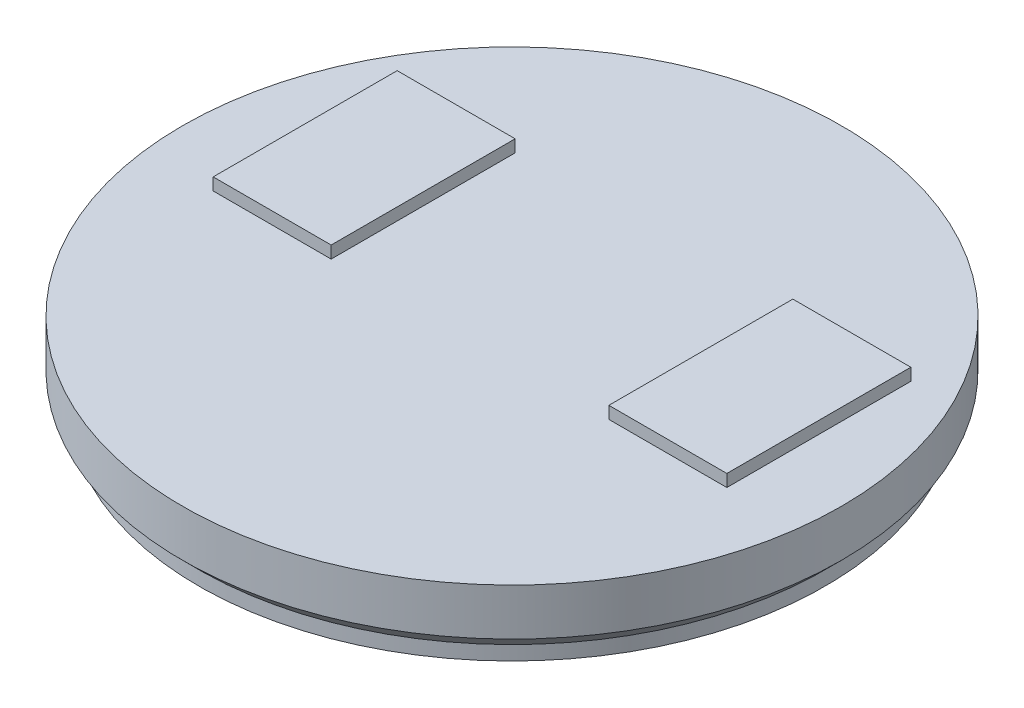
ISO-10303-21;
HEADER;
FILE_DESCRIPTION(('STEP AP214'),'2;1');
FILE_NAME('part.step','',(''),(''),'','','');
FILE_SCHEMA(('AUTOMOTIVE_DESIGN { 1 0 10303 214 1 1 1 1 }'));
ENDSEC;
DATA;
#1=APPLICATION_CONTEXT('core data for automotive mechanical design processes');
#2=APPLICATION_PROTOCOL_DEFINITION('international standard','automotive_design',2000,#1);
#3=PRODUCT_CONTEXT('',#1,'mechanical');
#4=PRODUCT('Part','Part','',(#3));
#5=PRODUCT_RELATED_PRODUCT_CATEGORY('part','',(#4));
#6=PRODUCT_DEFINITION_FORMATION('','',#4);
#7=PRODUCT_DEFINITION_CONTEXT('part definition',#1,'design');
#8=PRODUCT_DEFINITION('design','',#6,#7);
#9=PRODUCT_DEFINITION_SHAPE('','',#8);
#10=(LENGTH_UNIT() NAMED_UNIT(*) SI_UNIT(.MILLI.,.METRE.));
#11=(NAMED_UNIT(*) PLANE_ANGLE_UNIT() SI_UNIT($,.RADIAN.));
#12=(NAMED_UNIT(*) SI_UNIT($,.STERADIAN.) SOLID_ANGLE_UNIT());
#13=UNCERTAINTY_MEASURE_WITH_UNIT(LENGTH_MEASURE(1.E-05),#10,'distance_accuracy_value','');
#14=(GEOMETRIC_REPRESENTATION_CONTEXT(3) GLOBAL_UNCERTAINTY_ASSIGNED_CONTEXT((#13)) GLOBAL_UNIT_ASSIGNED_CONTEXT((#10,
#11,#12)) REPRESENTATION_CONTEXT('',''));
#15=CARTESIAN_POINT('',(0.,0.,0.));
#16=DIRECTION('',(0.,0.,1.));
#17=DIRECTION('',(1.,0.,0.));
#18=AXIS2_PLACEMENT_3D('',#15,#16,#17);
#19=CARTESIAN_POINT('',(0.,3.49999999999999,0.));
#20=DIRECTION('',(0.,1.,0.));
#21=DIRECTION('',(-1.,0.,0.));
#22=AXIS2_PLACEMENT_3D('',#19,#20,#21);
#23=CONICAL_SURFACE('',#22,77.,0.785398163397449);
#24=CARTESIAN_POINT('',(0.,3.49999999999999,0.));
#25=DIRECTION('',(0.,1.,0.));
#26=DIRECTION('',(-1.,0.,0.));
#27=AXIS2_PLACEMENT_3D('',#24,#25,#26);
#28=CIRCLE('',#27,77.);
#29=CARTESIAN_POINT('',(-77.,3.49999999999998,0.));
#30=VERTEX_POINT('',#29);
#31=EDGE_CURVE('E326',#30,#30,#28,.T.);
#32=ORIENTED_EDGE('',*,*,#31,.T.);
#33=EDGE_LOOP('',(#32));
#34=FACE_BOUND('',#33,.T.);
#35=CARTESIAN_POINT('',(0.,7.49999999999998,0.));
#36=DIRECTION('',(0.,1.,0.));
#37=DIRECTION('',(-1.,0.,0.));
#38=AXIS2_PLACEMENT_3D('',#35,#36,#37);
#39=CIRCLE('',#38,81.);
#40=CARTESIAN_POINT('',(-81.,7.49999999999997,0.));
#41=VERTEX_POINT('',#40);
#42=EDGE_CURVE('E48',#41,#41,#39,.T.);
#43=ORIENTED_EDGE('',*,*,#42,.F.);
#44=EDGE_LOOP('',(#43));
#45=FACE_BOUND('',#44,.T.);
#46=ADVANCED_FACE('F45',(#34,#45),#23,.T.);
#47=CARTESIAN_POINT('',(71.,12.,0.));
#48=DIRECTION('',(0.,1.,0.));
#49=DIRECTION('',(-1.,0.,0.));
#50=AXIS2_PLACEMENT_3D('',#47,#48,#49);
#51=PLANE('',#50);
#52=CARTESIAN_POINT('',(0.,12.,0.));
#53=DIRECTION('',(0.,-1.,0.));
#54=DIRECTION('',(1.,0.,0.));
#55=AXIS2_PLACEMENT_3D('',#52,#53,#54);
#56=CIRCLE('',#55,57.5);
#57=CARTESIAN_POINT('',(57.5,12.,0.));
#58=VERTEX_POINT('',#57);
#59=EDGE_CURVE('E251',#58,#58,#56,.T.);
#60=ORIENTED_EDGE('',*,*,#59,.F.);
#61=EDGE_LOOP('',(#60));
#62=FACE_BOUND('',#61,.T.);
#63=DIRECTION('',(0.,0.,1.));
#64=VECTOR('',#63,1.);
#65=CARTESIAN_POINT('',(60.875,12.,0.));
#66=LINE('',#65,#64);
#67=CARTESIAN_POINT('',(60.875,12.,-35.1461976369185));
#68=VERTEX_POINT('',#67);
#69=CARTESIAN_POINT('',(60.875,12.,35.1461976369185));
#70=VERTEX_POINT('',#69);
#71=EDGE_CURVE('E289',#68,#70,#66,.T.);
#72=ORIENTED_EDGE('',*,*,#71,.T.);
#73=DIRECTION('',(-0.866025403784439,0.,0.5));
#74=VECTOR('',#73,1.);
#75=CARTESIAN_POINT('',(30.4375,12.,52.7192964553777));
#76=LINE('',#75,#74);
#77=CARTESIAN_POINT('',(0.,12.,70.292395273837));
#78=VERTEX_POINT('',#77);
#79=EDGE_CURVE('E255',#70,#78,#76,.T.);
#80=ORIENTED_EDGE('',*,*,#79,.T.);
#81=DIRECTION('',(-0.866025403784439,0.,-0.5));
#82=VECTOR('',#81,1.);
#83=CARTESIAN_POINT('',(-30.4375,12.,52.7192964553777));
#84=LINE('',#83,#82);
#85=CARTESIAN_POINT('',(-60.875,12.,35.1461976369185));
#86=VERTEX_POINT('',#85);
#87=EDGE_CURVE('E261',#78,#86,#84,.T.);
#88=ORIENTED_EDGE('',*,*,#87,.T.);
#89=DIRECTION('',(0.,0.,-1.));
#90=VECTOR('',#89,1.);
#91=CARTESIAN_POINT('',(-60.875,12.,0.));
#92=LINE('',#91,#90);
#93=CARTESIAN_POINT('',(-60.875,12.,-35.1461976369185));
#94=VERTEX_POINT('',#93);
#95=EDGE_CURVE('E301',#86,#94,#92,.T.);
#96=ORIENTED_EDGE('',*,*,#95,.T.);
#97=DIRECTION('',(0.866025403784439,0.,-0.5));
#98=VECTOR('',#97,1.);
#99=CARTESIAN_POINT('',(-30.4375,12.,-52.7192964553777));
#100=LINE('',#99,#98);
#101=CARTESIAN_POINT('',(0.,12.,-70.2923952738369));
#102=VERTEX_POINT('',#101);
#103=EDGE_CURVE('E297',#94,#102,#100,.T.);
#104=ORIENTED_EDGE('',*,*,#103,.T.);
#105=DIRECTION('',(0.866025403784439,0.,0.5));
#106=VECTOR('',#105,1.);
#107=CARTESIAN_POINT('',(30.4375,12.,-52.7192964553777));
#108=LINE('',#107,#106);
#109=EDGE_CURVE('E293',#102,#68,#108,.T.);
#110=ORIENTED_EDGE('',*,*,#109,.T.);
#111=EDGE_LOOP('',(#72,#80,#88,#96,#104,#110));
#112=FACE_BOUND('',#111,.T.);
#113=ADVANCED_FACE('F373',(#62,#112),#51,.F.);
#114=CARTESIAN_POINT('',(30.4375,0.999999999999997,52.7192964553777));
#115=DIRECTION('',(-0.5,0.,-0.866025403784439));
#116=DIRECTION('',(-0.866025403784439,0.,0.5));
#117=AXIS2_PLACEMENT_3D('',#114,#115,#116);
#118=PLANE('',#117);
#119=ORIENTED_EDGE('',*,*,#79,.F.);
#120=DIRECTION('',(0.,1.,0.));
#121=VECTOR('',#120,1.);
#122=CARTESIAN_POINT('',(60.875,1.,35.1461976369185));
#123=LINE('',#122,#121);
#124=CARTESIAN_POINT('',(60.875,1.,35.1461976369185));
#125=VERTEX_POINT('',#124);
#126=EDGE_CURVE('E323',#125,#70,#123,.T.);
#127=ORIENTED_EDGE('',*,*,#126,.F.);
#128=DIRECTION('',(-0.866025403784439,0.,0.5));
#129=VECTOR('',#128,1.);
#130=CARTESIAN_POINT('',(30.4375,0.999999999999997,52.7192964553777));
#131=LINE('',#130,#129);
#132=CARTESIAN_POINT('',(0.,0.999999999999992,70.292395273837));
#133=VERTEX_POINT('',#132);
#134=EDGE_CURVE('E256',#125,#133,#131,.T.);
#135=ORIENTED_EDGE('',*,*,#134,.T.);
#136=DIRECTION('',(0.,1.,0.));
#137=VECTOR('',#136,1.);
#138=CARTESIAN_POINT('',(0.,0.999999999999992,70.292395273837));
#139=LINE('',#138,#137);
#140=EDGE_CURVE('E285',#133,#78,#139,.T.);
#141=ORIENTED_EDGE('',*,*,#140,.T.);
#142=EDGE_LOOP('',(#119,#127,#135,#141));
#143=FACE_BOUND('',#142,.T.);
#144=ADVANCED_FACE('F380',(#143),#118,.T.);
#145=CARTESIAN_POINT('',(60.875,1.,0.));
#146=DIRECTION('',(-1.,0.,0.));
#147=DIRECTION('',(0.,-1.,0.));
#148=AXIS2_PLACEMENT_3D('',#145,#146,#147);
#149=PLANE('',#148);
#150=ORIENTED_EDGE('',*,*,#71,.F.);
#151=DIRECTION('',(0.,1.,0.));
#152=VECTOR('',#151,1.);
#153=CARTESIAN_POINT('',(60.875,1.,-35.1461976369185));
#154=LINE('',#153,#152);
#155=CARTESIAN_POINT('',(60.875,1.,-35.1461976369185));
#156=VERTEX_POINT('',#155);
#157=EDGE_CURVE('E320',#156,#68,#154,.T.);
#158=ORIENTED_EDGE('',*,*,#157,.F.);
#159=DIRECTION('',(0.,0.,1.));
#160=VECTOR('',#159,1.);
#161=CARTESIAN_POINT('',(60.875,1.,0.));
#162=LINE('',#161,#160);
#163=EDGE_CURVE('E260',#156,#125,#162,.T.);
#164=ORIENTED_EDGE('',*,*,#163,.T.);
#165=ORIENTED_EDGE('',*,*,#126,.T.);
#166=EDGE_LOOP('',(#150,#158,#164,#165));
#167=FACE_BOUND('',#166,.T.);
#168=ADVANCED_FACE('F427',(#167),#149,.T.);
#169=CARTESIAN_POINT('',(30.4375,0.999999999999997,-52.7192964553777));
#170=DIRECTION('',(-0.5,0.,0.866025403784439));
#171=DIRECTION('',(0.866025403784439,0.,0.5));
#172=AXIS2_PLACEMENT_3D('',#169,#170,#171);
#173=PLANE('',#172);
#174=ORIENTED_EDGE('',*,*,#109,.F.);
#175=DIRECTION('',(0.,1.,0.));
#176=VECTOR('',#175,1.);
#177=CARTESIAN_POINT('',(0.,0.999999999999992,-70.2923952738369));
#178=LINE('',#177,#176);
#179=CARTESIAN_POINT('',(0.,0.999999999999992,-70.2923952738369));
#180=VERTEX_POINT('',#179);
#181=EDGE_CURVE('E317',#180,#102,#178,.T.);
#182=ORIENTED_EDGE('',*,*,#181,.F.);
#183=DIRECTION('',(0.866025403784439,0.,0.5));
#184=VECTOR('',#183,1.);
#185=CARTESIAN_POINT('',(30.4375,0.999999999999997,-52.7192964553777));
#186=LINE('',#185,#184);
#187=EDGE_CURVE('E265',#180,#156,#186,.T.);
#188=ORIENTED_EDGE('',*,*,#187,.T.);
#189=ORIENTED_EDGE('',*,*,#157,.T.);
#190=EDGE_LOOP('',(#174,#182,#188,#189));
#191=FACE_BOUND('',#190,.T.);
#192=ADVANCED_FACE('F423',(#191),#173,.T.);
#193=CARTESIAN_POINT('',(-30.4375,0.999999999999987,-52.7192964553777));
#194=DIRECTION('',(0.5,0.,0.866025403784439));
#195=DIRECTION('',(0.866025403784439,0.,-0.5));
#196=AXIS2_PLACEMENT_3D('',#193,#194,#195);
#197=PLANE('',#196);
#198=ORIENTED_EDGE('',*,*,#103,.F.);
#199=DIRECTION('',(0.,1.,0.));
#200=VECTOR('',#199,1.);
#201=CARTESIAN_POINT('',(-60.875,0.999999999999984,-35.1461976369185));
#202=LINE('',#201,#200);
#203=CARTESIAN_POINT('',(-60.875,0.999999999999984,-35.1461976369185));
#204=VERTEX_POINT('',#203);
#205=EDGE_CURVE('E314',#204,#94,#202,.T.);
#206=ORIENTED_EDGE('',*,*,#205,.F.);
#207=DIRECTION('',(0.866025403784439,0.,-0.5));
#208=VECTOR('',#207,1.);
#209=CARTESIAN_POINT('',(-30.4375,0.999999999999987,-52.7192964553777));
#210=LINE('',#209,#208);
#211=EDGE_CURVE('E269',#204,#180,#210,.T.);
#212=ORIENTED_EDGE('',*,*,#211,.T.);
#213=ORIENTED_EDGE('',*,*,#181,.T.);
#214=EDGE_LOOP('',(#198,#206,#212,#213));
#215=FACE_BOUND('',#214,.T.);
#216=ADVANCED_FACE('F419',(#215),#197,.T.);
#217=CARTESIAN_POINT('',(-60.875,0.999999999999984,0.));
#218=DIRECTION('',(1.,0.,0.));
#219=DIRECTION('',(0.,1.,0.));
#220=AXIS2_PLACEMENT_3D('',#217,#218,#219);
#221=PLANE('',#220);
#222=ORIENTED_EDGE('',*,*,#95,.F.);
#223=DIRECTION('',(0.,1.,0.));
#224=VECTOR('',#223,1.);
#225=CARTESIAN_POINT('',(-60.875,0.999999999999982,35.1461976369185));
#226=LINE('',#225,#224);
#227=CARTESIAN_POINT('',(-60.875,0.999999999999982,35.1461976369185));
#228=VERTEX_POINT('',#227);
#229=EDGE_CURVE('E310',#228,#86,#226,.T.);
#230=ORIENTED_EDGE('',*,*,#229,.F.);
#231=DIRECTION('',(0.,0.,-1.));
#232=VECTOR('',#231,1.);
#233=CARTESIAN_POINT('',(-60.875,0.999999999999984,0.));
#234=LINE('',#233,#232);
#235=EDGE_CURVE('E273',#228,#204,#234,.T.);
#236=ORIENTED_EDGE('',*,*,#235,.T.);
#237=ORIENTED_EDGE('',*,*,#205,.T.);
#238=EDGE_LOOP('',(#222,#230,#236,#237));
#239=FACE_BOUND('',#238,.T.);
#240=ADVANCED_FACE('F415',(#239),#221,.T.);
#241=CARTESIAN_POINT('',(-30.4375,0.999999999999987,52.7192964553777));
#242=DIRECTION('',(0.5,0.,-0.866025403784439));
#243=DIRECTION('',(-0.866025403784439,0.,-0.5));
#244=AXIS2_PLACEMENT_3D('',#241,#242,#243);
#245=PLANE('',#244);
#246=ORIENTED_EDGE('',*,*,#87,.F.);
#247=ORIENTED_EDGE('',*,*,#140,.F.);
#248=DIRECTION('',(-0.866025403784439,0.,-0.5));
#249=VECTOR('',#248,1.);
#250=CARTESIAN_POINT('',(-30.4375,0.999999999999987,52.7192964553777));
#251=LINE('',#250,#249);
#252=EDGE_CURVE('E277',#133,#228,#251,.T.);
#253=ORIENTED_EDGE('',*,*,#252,.T.);
#254=ORIENTED_EDGE('',*,*,#229,.T.);
#255=EDGE_LOOP('',(#246,#247,#253,#254));
#256=FACE_BOUND('',#255,.T.);
#257=ADVANCED_FACE('F411',(#256),#245,.T.);
#258=CARTESIAN_POINT('',(0.,0.999999999999992,0.));
#259=DIRECTION('',(0.,-1.,0.));
#260=DIRECTION('',(1.,0.,0.));
#261=AXIS2_PLACEMENT_3D('',#258,#259,#260);
#262=PLANE('',#261);
#263=ORIENTED_EDGE('',*,*,#134,.F.);
#264=ORIENTED_EDGE('',*,*,#163,.F.);
#265=ORIENTED_EDGE('',*,*,#187,.F.);
#266=ORIENTED_EDGE('',*,*,#211,.F.);
#267=ORIENTED_EDGE('',*,*,#235,.F.);
#268=ORIENTED_EDGE('',*,*,#252,.F.);
#269=EDGE_LOOP('',(#263,#264,#265,#266,#267,#268));
#270=FACE_BOUND('',#269,.T.);
#271=CARTESIAN_POINT('',(0.,0.999999999999992,0.));
#272=DIRECTION('',(0.,-1.,0.));
#273=DIRECTION('',(1.,0.,0.));
#274=AXIS2_PLACEMENT_3D('',#271,#272,#273);
#275=CIRCLE('',#274,71.);
#276=CARTESIAN_POINT('',(71.,1.,0.));
#277=VERTEX_POINT('',#276);
#278=EDGE_CURVE('E281',#277,#277,#275,.T.);
#279=ORIENTED_EDGE('',*,*,#278,.T.);
#280=EDGE_LOOP('',(#279));
#281=FACE_BOUND('',#280,.T.);
#282=ADVANCED_FACE('F407',(#270,#281),#262,.T.);
#283=CARTESIAN_POINT('',(0.,12.,0.));
#284=DIRECTION('',(0.,1.,0.));
#285=DIRECTION('',(-1.,0.,0.));
#286=AXIS2_PLACEMENT_3D('',#283,#284,#285);
#287=CYLINDRICAL_SURFACE('',#286,77.);
#288=ORIENTED_EDGE('',*,*,#31,.F.);
#289=EDGE_LOOP('',(#288));
#290=FACE_BOUND('',#289,.T.);
#291=CARTESIAN_POINT('',(0.,0.,0.));
#292=DIRECTION('',(0.,1.,0.));
#293=DIRECTION('',(-1.,0.,0.));
#294=AXIS2_PLACEMENT_3D('',#291,#292,#293);
#295=CIRCLE('',#294,77.);
#296=CARTESIAN_POINT('',(-77.,0.,0.));
#297=VERTEX_POINT('',#296);
#298=EDGE_CURVE('E330',#297,#297,#295,.T.);
#299=ORIENTED_EDGE('',*,*,#298,.T.);
#300=EDGE_LOOP('',(#299));
#301=FACE_BOUND('',#300,.T.);
#302=ADVANCED_FACE('F410',(#290,#301),#287,.T.);
#303=CARTESIAN_POINT('',(77.,0.,0.));
#304=DIRECTION('',(0.,1.,0.));
#305=DIRECTION('',(-1.,0.,0.));
#306=AXIS2_PLACEMENT_3D('',#303,#304,#305);
#307=PLANE('',#306);
#308=ORIENTED_EDGE('',*,*,#298,.F.);
#309=EDGE_LOOP('',(#308));
#310=FACE_BOUND('',#309,.T.);
#311=CARTESIAN_POINT('',(0.,0.,0.));
#312=DIRECTION('',(0.,1.,0.));
#313=DIRECTION('',(-1.,0.,0.));
#314=AXIS2_PLACEMENT_3D('',#311,#312,#313);
#315=CIRCLE('',#314,71.);
#316=CARTESIAN_POINT('',(-71.,0.,0.));
#317=VERTEX_POINT('',#316);
#318=EDGE_CURVE('E334',#317,#317,#315,.T.);
#319=ORIENTED_EDGE('',*,*,#318,.T.);
#320=EDGE_LOOP('',(#319));
#321=FACE_BOUND('',#320,.T.);
#322=ADVANCED_FACE('F437',(#310,#321),#307,.F.);
#323=CARTESIAN_POINT('',(0.,12.,0.));
#324=DIRECTION('',(0.,1.,0.));
#325=DIRECTION('',(-1.,0.,0.));
#326=AXIS2_PLACEMENT_3D('',#323,#324,#325);
#327=CYLINDRICAL_SURFACE('',#326,71.);
#328=ORIENTED_EDGE('',*,*,#278,.F.);
#329=EDGE_LOOP('',(#328));
#330=FACE_BOUND('',#329,.T.);
#331=ORIENTED_EDGE('',*,*,#318,.F.);
#332=EDGE_LOOP('',(#331));
#333=FACE_BOUND('',#332,.T.);
#334=ADVANCED_FACE('F405',(#330,#333),#327,.F.);
#335=CARTESIAN_POINT('',(0.,13.,0.));
#336=DIRECTION('',(0.,-1.,0.));
#337=DIRECTION('',(1.,0.,0.));
#338=AXIS2_PLACEMENT_3D('',#335,#336,#337);
#339=CYLINDRICAL_SURFACE('',#338,57.5);
#340=ORIENTED_EDGE('',*,*,#59,.T.);
#341=EDGE_LOOP('',(#340));
#342=FACE_BOUND('',#341,.T.);
#343=CARTESIAN_POINT('',(0.,15.,0.));
#344=DIRECTION('',(0.,-1.,0.));
#345=DIRECTION('',(1.,0.,0.));
#346=AXIS2_PLACEMENT_3D('',#343,#344,#345);
#347=CIRCLE('',#346,57.5);
#348=CARTESIAN_POINT('',(57.5,15.,0.));
#349=VERTEX_POINT('',#348);
#350=EDGE_CURVE('E243',#349,#349,#347,.T.);
#351=ORIENTED_EDGE('',*,*,#350,.F.);
#352=EDGE_LOOP('',(#351));
#353=FACE_BOUND('',#352,.T.);
#354=ADVANCED_FACE('F392',(#342,#353),#339,.F.);
#355=CARTESIAN_POINT('',(0.,4.99999999999999,0.));
#356=DIRECTION('',(0.,1.,0.));
#357=DIRECTION('',(-1.,0.,0.));
#358=AXIS2_PLACEMENT_3D('',#355,#356,#357);
#359=CYLINDRICAL_SURFACE('',#358,81.);
#360=ORIENTED_EDGE('',*,*,#42,.T.);
#361=EDGE_LOOP('',(#360));
#362=FACE_BOUND('',#361,.T.);
#363=CARTESIAN_POINT('',(0.,19.,0.));
#364=DIRECTION('',(0.,1.,0.));
#365=DIRECTION('',(-1.,0.,0.));
#366=AXIS2_PLACEMENT_3D('',#363,#364,#365);
#367=CIRCLE('',#366,81.);
#368=CARTESIAN_POINT('',(-81.,19.,0.));
#369=VERTEX_POINT('',#368);
#370=EDGE_CURVE('E247',#369,#369,#367,.T.);
#371=ORIENTED_EDGE('',*,*,#370,.F.);
#372=EDGE_LOOP('',(#371));
#373=FACE_BOUND('',#372,.T.);
#374=ADVANCED_FACE('F389',(#362,#373),#359,.T.);
#375=CARTESIAN_POINT('',(0.,19.,0.));
#376=DIRECTION('',(0.,1.,0.));
#377=DIRECTION('',(-1.,0.,0.));
#378=AXIS2_PLACEMENT_3D('',#375,#376,#377);
#379=PLANE('',#378);
#380=DIRECTION('',(-1.,0.,0.));
#381=VECTOR('',#380,1.);
#382=CARTESIAN_POINT('',(0.,19.,10.11));
#383=LINE('',#382,#381);
#384=CARTESIAN_POINT('',(62.9163510990038,19.,10.11));
#385=VERTEX_POINT('',#384);
#386=CARTESIAN_POINT('',(33.9163510990038,19.,10.11));
#387=VERTEX_POINT('',#386);
#388=EDGE_CURVE('E152',#385,#387,#383,.T.);
#389=ORIENTED_EDGE('',*,*,#388,.T.);
#390=DIRECTION('',(0.,0.,-1.));
#391=VECTOR('',#390,1.);
#392=CARTESIAN_POINT('',(33.9163510990038,19.,0.));
#393=LINE('',#392,#391);
#394=CARTESIAN_POINT('',(33.9163510990038,19.,-35.11));
#395=VERTEX_POINT('',#394);
#396=EDGE_CURVE('E168',#387,#395,#393,.T.);
#397=ORIENTED_EDGE('',*,*,#396,.T.);
#398=DIRECTION('',(1.,0.,0.));
#399=VECTOR('',#398,1.);
#400=CARTESIAN_POINT('',(0.,19.,-35.11));
#401=LINE('',#400,#399);
#402=CARTESIAN_POINT('',(62.9163510990038,19.,-35.11));
#403=VERTEX_POINT('',#402);
#404=EDGE_CURVE('E66',#395,#403,#401,.T.);
#405=ORIENTED_EDGE('',*,*,#404,.T.);
#406=DIRECTION('',(0.,0.,1.));
#407=VECTOR('',#406,1.);
#408=CARTESIAN_POINT('',(62.9163510990038,19.,0.));
#409=LINE('',#408,#407);
#410=EDGE_CURVE('E61',#403,#385,#409,.T.);
#411=ORIENTED_EDGE('',*,*,#410,.T.);
#412=EDGE_LOOP('',(#389,#397,#405,#411));
#413=FACE_BOUND('',#412,.T.);
#414=DIRECTION('',(0.,0.,-1.));
#415=VECTOR('',#414,1.);
#416=CARTESIAN_POINT('',(-63.3336489009962,19.,0.));
#417=LINE('',#416,#415);
#418=CARTESIAN_POINT('',(-63.3336489009962,19.,10.11));
#419=VERTEX_POINT('',#418);
#420=CARTESIAN_POINT('',(-63.3336489009962,19.,-35.11));
#421=VERTEX_POINT('',#420);
#422=EDGE_CURVE('E156',#419,#421,#417,.T.);
#423=ORIENTED_EDGE('',*,*,#422,.T.);
#424=DIRECTION('',(1.,0.,0.));
#425=VECTOR('',#424,1.);
#426=CARTESIAN_POINT('',(0.,19.,-35.11));
#427=LINE('',#426,#425);
#428=CARTESIAN_POINT('',(-34.3336489009962,19.,-35.11));
#429=VERTEX_POINT('',#428);
#430=EDGE_CURVE('E201',#421,#429,#427,.T.);
#431=ORIENTED_EDGE('',*,*,#430,.T.);
#432=DIRECTION('',(0.,0.,1.));
#433=VECTOR('',#432,1.);
#434=CARTESIAN_POINT('',(-34.3336489009962,19.,0.));
#435=LINE('',#434,#433);
#436=CARTESIAN_POINT('',(-34.3336489009962,19.,10.11));
#437=VERTEX_POINT('',#436);
#438=EDGE_CURVE('E219',#429,#437,#435,.T.);
#439=ORIENTED_EDGE('',*,*,#438,.T.);
#440=DIRECTION('',(-1.,0.,0.));
#441=VECTOR('',#440,1.);
#442=CARTESIAN_POINT('',(0.,19.,10.11));
#443=LINE('',#442,#441);
#444=EDGE_CURVE('E216',#437,#419,#443,.T.);
#445=ORIENTED_EDGE('',*,*,#444,.T.);
#446=EDGE_LOOP('',(#423,#431,#439,#445));
#447=FACE_BOUND('',#446,.T.);
#448=ORIENTED_EDGE('',*,*,#370,.T.);
#449=EDGE_LOOP('',(#448));
#450=FACE_BOUND('',#449,.T.);
#451=ADVANCED_FACE('F369',(#413,#447,#450),#379,.T.);
#452=CARTESIAN_POINT('',(0.,15.,0.));
#453=DIRECTION('',(0.,-1.,0.));
#454=DIRECTION('',(1.,0.,0.));
#455=AXIS2_PLACEMENT_3D('',#452,#453,#454);
#456=PLANE('',#455);
#457=CARTESIAN_POINT('',(0.,15.,0.));
#458=DIRECTION('',(0.,-1.,0.));
#459=DIRECTION('',(1.,0.,0.));
#460=AXIS2_PLACEMENT_3D('',#457,#458,#459);
#461=CIRCLE('',#460,23.75);
#462=CARTESIAN_POINT('',(23.75,15.,0.));
#463=VERTEX_POINT('',#462);
#464=EDGE_CURVE('E239',#463,#463,#461,.T.);
#465=ORIENTED_EDGE('',*,*,#464,.F.);
#466=EDGE_LOOP('',(#465));
#467=FACE_BOUND('',#466,.T.);
#468=ORIENTED_EDGE('',*,*,#350,.T.);
#469=EDGE_LOOP('',(#468));
#470=FACE_BOUND('',#469,.T.);
#471=ADVANCED_FACE('F364',(#467,#470),#456,.T.);
#472=CARTESIAN_POINT('',(0.,8.99999999999999,0.));
#473=DIRECTION('',(0.,1.,0.));
#474=DIRECTION('',(-1.,0.,0.));
#475=AXIS2_PLACEMENT_3D('',#472,#473,#474);
#476=PLANE('',#475);
#477=CARTESIAN_POINT('',(0.,8.99999999999999,0.));
#478=DIRECTION('',(0.,1.,0.));
#479=DIRECTION('',(-1.,0.,0.));
#480=AXIS2_PLACEMENT_3D('',#477,#478,#479);
#481=CIRCLE('',#480,6.5);
#482=CARTESIAN_POINT('',(-6.5,8.99999999999999,0.));
#483=VERTEX_POINT('',#482);
#484=EDGE_CURVE('E11',#483,#483,#481,.T.);
#485=ORIENTED_EDGE('',*,*,#484,.F.);
#486=EDGE_LOOP('',(#485));
#487=FACE_BOUND('',#486,.T.);
#488=ADVANCED_FACE('F359',(#487),#476,.F.);
#489=CARTESIAN_POINT('',(0.,12.,0.));
#490=DIRECTION('',(0.,1.,0.));
#491=DIRECTION('',(-1.,0.,0.));
#492=AXIS2_PLACEMENT_3D('',#489,#490,#491);
#493=CYLINDRICAL_SURFACE('',#492,6.5);
#494=CARTESIAN_POINT('',(0.,5.99999999999999,0.));
#495=DIRECTION('',(0.,1.,0.));
#496=DIRECTION('',(-1.,0.,0.));
#497=AXIS2_PLACEMENT_3D('',#494,#495,#496);
#498=CIRCLE('',#497,6.5);
#499=CARTESIAN_POINT('',(-6.5,5.99999999999999,0.));
#500=VERTEX_POINT('',#499);
#501=EDGE_CURVE('E54',#500,#500,#498,.T.);
#502=ORIENTED_EDGE('',*,*,#501,.F.);
#503=EDGE_LOOP('',(#502));
#504=FACE_BOUND('',#503,.T.);
#505=ORIENTED_EDGE('',*,*,#484,.T.);
#506=EDGE_LOOP('',(#505));
#507=FACE_BOUND('',#506,.T.);
#508=ADVANCED_FACE('F356',(#504,#507),#493,.F.);
#509=CARTESIAN_POINT('',(6.5,5.99999999999999,0.));
#510=DIRECTION('',(0.,1.,0.));
#511=DIRECTION('',(-1.,0.,0.));
#512=AXIS2_PLACEMENT_3D('',#509,#510,#511);
#513=PLANE('',#512);
#514=CARTESIAN_POINT('',(0.,5.99999999999999,0.));
#515=DIRECTION('',(0.,1.,0.));
#516=DIRECTION('',(-1.,0.,0.));
#517=AXIS2_PLACEMENT_3D('',#514,#515,#516);
#518=CIRCLE('',#517,21.25);
#519=CARTESIAN_POINT('',(-21.25,5.99999999999999,0.));
#520=VERTEX_POINT('',#519);
#521=EDGE_CURVE('E346',#520,#520,#518,.T.);
#522=ORIENTED_EDGE('',*,*,#521,.F.);
#523=EDGE_LOOP('',(#522));
#524=FACE_BOUND('',#523,.T.);
#525=ORIENTED_EDGE('',*,*,#501,.T.);
#526=EDGE_LOOP('',(#525));
#527=FACE_BOUND('',#526,.T.);
#528=ADVANCED_FACE('F354',(#524,#527),#513,.F.);
#529=CARTESIAN_POINT('',(0.,12.,0.));
#530=DIRECTION('',(0.,1.,0.));
#531=DIRECTION('',(-1.,0.,0.));
#532=AXIS2_PLACEMENT_3D('',#529,#530,#531);
#533=CYLINDRICAL_SURFACE('',#532,21.25);
#534=CARTESIAN_POINT('',(0.,-7.50000000000001,0.));
#535=DIRECTION('',(0.,1.,0.));
#536=DIRECTION('',(-1.,0.,0.));
#537=AXIS2_PLACEMENT_3D('',#534,#535,#536);
#538=CIRCLE('',#537,21.25);
#539=CARTESIAN_POINT('',(-21.25,-7.50000000000001,0.));
#540=VERTEX_POINT('',#539);
#541=EDGE_CURVE('E342',#540,#540,#538,.T.);
#542=ORIENTED_EDGE('',*,*,#541,.F.);
#543=EDGE_LOOP('',(#542));
#544=FACE_BOUND('',#543,.T.);
#545=ORIENTED_EDGE('',*,*,#521,.T.);
#546=EDGE_LOOP('',(#545));
#547=FACE_BOUND('',#546,.T.);
#548=ADVANCED_FACE('F452',(#544,#547),#533,.F.);
#549=CARTESIAN_POINT('',(21.25,-7.50000000000001,0.));
#550=DIRECTION('',(0.,1.,0.));
#551=DIRECTION('',(-1.,0.,0.));
#552=AXIS2_PLACEMENT_3D('',#549,#550,#551);
#553=PLANE('',#552);
#554=CARTESIAN_POINT('',(0.,-7.50000000000001,0.));
#555=DIRECTION('',(0.,1.,0.));
#556=DIRECTION('',(-1.,0.,0.));
#557=AXIS2_PLACEMENT_3D('',#554,#555,#556);
#558=CIRCLE('',#557,23.75);
#559=CARTESIAN_POINT('',(-23.75,-7.50000000000001,0.));
#560=VERTEX_POINT('',#559);
#561=EDGE_CURVE('E338',#560,#560,#558,.T.);
#562=ORIENTED_EDGE('',*,*,#561,.F.);
#563=EDGE_LOOP('',(#562));
#564=FACE_BOUND('',#563,.T.);
#565=ORIENTED_EDGE('',*,*,#541,.T.);
#566=EDGE_LOOP('',(#565));
#567=FACE_BOUND('',#566,.T.);
#568=ADVANCED_FACE('F448',(#564,#567),#553,.F.);
#569=CARTESIAN_POINT('',(0.,12.,0.));
#570=DIRECTION('',(0.,1.,0.));
#571=DIRECTION('',(-1.,0.,0.));
#572=AXIS2_PLACEMENT_3D('',#569,#570,#571);
#573=CYLINDRICAL_SURFACE('',#572,23.75);
#574=ORIENTED_EDGE('',*,*,#561,.T.);
#575=EDGE_LOOP('',(#574));
#576=FACE_BOUND('',#575,.T.);
#577=ORIENTED_EDGE('',*,*,#464,.T.);
#578=EDGE_LOOP('',(#577));
#579=FACE_BOUND('',#578,.T.);
#580=ADVANCED_FACE('F444',(#576,#579),#573,.T.);
#581=CARTESIAN_POINT('',(-63.3336489009962,22.,0.));
#582=DIRECTION('',(-1.,0.,0.));
#583=DIRECTION('',(0.,-1.,0.));
#584=AXIS2_PLACEMENT_3D('',#581,#582,#583);
#585=PLANE('',#584);
#586=ORIENTED_EDGE('',*,*,#422,.F.);
#587=DIRECTION('',(0.,-1.,0.));
#588=VECTOR('',#587,1.);
#589=CARTESIAN_POINT('',(-63.3336489009962,22.,10.11));
#590=LINE('',#589,#588);
#591=CARTESIAN_POINT('',(-63.3336489009962,22.,10.11));
#592=VERTEX_POINT('',#591);
#593=EDGE_CURVE('E235',#592,#419,#590,.T.);
#594=ORIENTED_EDGE('',*,*,#593,.F.);
#595=DIRECTION('',(0.,0.,-1.));
#596=VECTOR('',#595,1.);
#597=CARTESIAN_POINT('',(-63.3336489009962,22.,0.));
#598=LINE('',#597,#596);
#599=CARTESIAN_POINT('',(-63.3336489009962,22.,-35.11));
#600=VERTEX_POINT('',#599);
#601=EDGE_CURVE('E196',#592,#600,#598,.T.);
#602=ORIENTED_EDGE('',*,*,#601,.T.);
#603=DIRECTION('',(0.,-1.,0.));
#604=VECTOR('',#603,1.);
#605=CARTESIAN_POINT('',(-63.3336489009962,22.,-35.11));
#606=LINE('',#605,#604);
#607=EDGE_CURVE('E213',#600,#421,#606,.T.);
#608=ORIENTED_EDGE('',*,*,#607,.T.);
#609=EDGE_LOOP('',(#586,#594,#602,#608));
#610=FACE_BOUND('',#609,.T.);
#611=ADVANCED_FACE('F447',(#610),#585,.T.);
#612=CARTESIAN_POINT('',(0.,22.,10.11));
#613=DIRECTION('',(0.,0.,1.));
#614=DIRECTION('',(1.,0.,0.));
#615=AXIS2_PLACEMENT_3D('',#612,#613,#614);
#616=PLANE('',#615);
#617=ORIENTED_EDGE('',*,*,#444,.F.);
#618=DIRECTION('',(0.,-1.,0.));
#619=VECTOR('',#618,1.);
#620=CARTESIAN_POINT('',(-34.3336489009962,22.,10.11));
#621=LINE('',#620,#619);
#622=CARTESIAN_POINT('',(-34.3336489009962,22.,10.11));
#623=VERTEX_POINT('',#622);
#624=EDGE_CURVE('E231',#623,#437,#621,.T.);
#625=ORIENTED_EDGE('',*,*,#624,.F.);
#626=DIRECTION('',(-1.,0.,0.));
#627=VECTOR('',#626,1.);
#628=CARTESIAN_POINT('',(0.,22.,10.11));
#629=LINE('',#628,#627);
#630=EDGE_CURVE('E200',#623,#592,#629,.T.);
#631=ORIENTED_EDGE('',*,*,#630,.T.);
#632=ORIENTED_EDGE('',*,*,#593,.T.);
#633=EDGE_LOOP('',(#617,#625,#631,#632));
#634=FACE_BOUND('',#633,.T.);
#635=ADVANCED_FACE('F530',(#634),#616,.T.);
#636=CARTESIAN_POINT('',(-34.3336489009962,22.,0.));
#637=DIRECTION('',(1.,0.,0.));
#638=DIRECTION('',(0.,1.,0.));
#639=AXIS2_PLACEMENT_3D('',#636,#637,#638);
#640=PLANE('',#639);
#641=ORIENTED_EDGE('',*,*,#438,.F.);
#642=DIRECTION('',(0.,-1.,0.));
#643=VECTOR('',#642,1.);
#644=CARTESIAN_POINT('',(-34.3336489009962,22.,-35.11));
#645=LINE('',#644,#643);
#646=CARTESIAN_POINT('',(-34.3336489009962,22.,-35.11));
#647=VERTEX_POINT('',#646);
#648=EDGE_CURVE('E227',#647,#429,#645,.T.);
#649=ORIENTED_EDGE('',*,*,#648,.F.);
#650=DIRECTION('',(0.,0.,1.));
#651=VECTOR('',#650,1.);
#652=CARTESIAN_POINT('',(-34.3336489009962,22.,0.));
#653=LINE('',#652,#651);
#654=EDGE_CURVE('E205',#647,#623,#653,.T.);
#655=ORIENTED_EDGE('',*,*,#654,.T.);
#656=ORIENTED_EDGE('',*,*,#624,.T.);
#657=EDGE_LOOP('',(#641,#649,#655,#656));
#658=FACE_BOUND('',#657,.T.);
#659=ADVANCED_FACE('F543',(#658),#640,.T.);
#660=CARTESIAN_POINT('',(0.,22.,-35.11));
#661=DIRECTION('',(0.,0.,-1.));
#662=DIRECTION('',(-1.,0.,0.));
#663=AXIS2_PLACEMENT_3D('',#660,#661,#662);
#664=PLANE('',#663);
#665=ORIENTED_EDGE('',*,*,#430,.F.);
#666=ORIENTED_EDGE('',*,*,#607,.F.);
#667=DIRECTION('',(1.,0.,0.));
#668=VECTOR('',#667,1.);
#669=CARTESIAN_POINT('',(0.,22.,-35.11));
#670=LINE('',#669,#668);
#671=EDGE_CURVE('E209',#600,#647,#670,.T.);
#672=ORIENTED_EDGE('',*,*,#671,.T.);
#673=ORIENTED_EDGE('',*,*,#648,.T.);
#674=EDGE_LOOP('',(#665,#666,#672,#673));
#675=FACE_BOUND('',#674,.T.);
#676=ADVANCED_FACE('F554',(#675),#664,.T.);
#677=CARTESIAN_POINT('',(0.,22.,0.));
#678=DIRECTION('',(0.,1.,0.));
#679=DIRECTION('',(-1.,0.,0.));
#680=AXIS2_PLACEMENT_3D('',#677,#678,#679);
#681=PLANE('',#680);
#682=ORIENTED_EDGE('',*,*,#601,.F.);
#683=ORIENTED_EDGE('',*,*,#630,.F.);
#684=ORIENTED_EDGE('',*,*,#654,.F.);
#685=ORIENTED_EDGE('',*,*,#671,.F.);
#686=EDGE_LOOP('',(#682,#683,#684,#685));
#687=FACE_BOUND('',#686,.T.);
#688=ADVANCED_FACE('F568',(#687),#681,.T.);
#689=CARTESIAN_POINT('',(0.,22.,10.11));
#690=DIRECTION('',(0.,0.,1.));
#691=DIRECTION('',(1.,0.,0.));
#692=AXIS2_PLACEMENT_3D('',#689,#690,#691);
#693=PLANE('',#692);
#694=ORIENTED_EDGE('',*,*,#388,.F.);
#695=DIRECTION('',(0.,-1.,0.));
#696=VECTOR('',#695,1.);
#697=CARTESIAN_POINT('',(62.9163510990038,22.,10.11));
#698=LINE('',#697,#696);
#699=CARTESIAN_POINT('',(62.9163510990038,22.,10.11));
#700=VERTEX_POINT('',#699);
#701=EDGE_CURVE('E146',#700,#385,#698,.T.);
#702=ORIENTED_EDGE('',*,*,#701,.F.);
#703=DIRECTION('',(-1.,0.,0.));
#704=VECTOR('',#703,1.);
#705=CARTESIAN_POINT('',(0.,22.,10.11));
#706=LINE('',#705,#704);
#707=CARTESIAN_POINT('',(33.9163510990038,22.,10.11));
#708=VERTEX_POINT('',#707);
#709=EDGE_CURVE('E150',#700,#708,#706,.T.);
#710=ORIENTED_EDGE('',*,*,#709,.T.);
#711=DIRECTION('',(0.,-1.,0.));
#712=VECTOR('',#711,1.);
#713=CARTESIAN_POINT('',(33.9163510990038,22.,10.11));
#714=LINE('',#713,#712);
#715=EDGE_CURVE('E179',#708,#387,#714,.T.);
#716=ORIENTED_EDGE('',*,*,#715,.T.);
#717=EDGE_LOOP('',(#694,#702,#710,#716));
#718=FACE_BOUND('',#717,.T.);
#719=ADVANCED_FACE('F148',(#718),#693,.T.);
#720=CARTESIAN_POINT('',(62.9163510990038,22.,0.));
#721=DIRECTION('',(1.,0.,0.));
#722=DIRECTION('',(0.,1.,0.));
#723=AXIS2_PLACEMENT_3D('',#720,#721,#722);
#724=PLANE('',#723);
#725=ORIENTED_EDGE('',*,*,#410,.F.);
#726=DIRECTION('',(0.,-1.,0.));
#727=VECTOR('',#726,1.);
#728=CARTESIAN_POINT('',(62.9163510990038,22.,-35.11));
#729=LINE('',#728,#727);
#730=CARTESIAN_POINT('',(62.9163510990038,22.,-35.11));
#731=VERTEX_POINT('',#730);
#732=EDGE_CURVE('E157',#731,#403,#729,.T.);
#733=ORIENTED_EDGE('',*,*,#732,.F.);
#734=DIRECTION('',(0.,0.,1.));
#735=VECTOR('',#734,1.);
#736=CARTESIAN_POINT('',(62.9163510990038,22.,0.));
#737=LINE('',#736,#735);
#738=EDGE_CURVE('E163',#731,#700,#737,.T.);
#739=ORIENTED_EDGE('',*,*,#738,.T.);
#740=ORIENTED_EDGE('',*,*,#701,.T.);
#741=EDGE_LOOP('',(#725,#733,#739,#740));
#742=FACE_BOUND('',#741,.T.);
#743=ADVANCED_FACE('F170',(#742),#724,.T.);
#744=CARTESIAN_POINT('',(0.,22.,-35.11));
#745=DIRECTION('',(0.,0.,-1.));
#746=DIRECTION('',(-1.,0.,0.));
#747=AXIS2_PLACEMENT_3D('',#744,#745,#746);
#748=PLANE('',#747);
#749=ORIENTED_EDGE('',*,*,#404,.F.);
#750=DIRECTION('',(0.,-1.,0.));
#751=VECTOR('',#750,1.);
#752=CARTESIAN_POINT('',(33.9163510990038,22.,-35.11));
#753=LINE('',#752,#751);
#754=CARTESIAN_POINT('',(33.9163510990038,22.,-35.11));
#755=VERTEX_POINT('',#754);
#756=EDGE_CURVE('E190',#755,#395,#753,.T.);
#757=ORIENTED_EDGE('',*,*,#756,.F.);
#758=DIRECTION('',(1.,0.,0.));
#759=VECTOR('',#758,1.);
#760=CARTESIAN_POINT('',(0.,22.,-35.11));
#761=LINE('',#760,#759);
#762=EDGE_CURVE('E172',#755,#731,#761,.T.);
#763=ORIENTED_EDGE('',*,*,#762,.T.);
#764=ORIENTED_EDGE('',*,*,#732,.T.);
#765=EDGE_LOOP('',(#749,#757,#763,#764));
#766=FACE_BOUND('',#765,.T.);
#767=ADVANCED_FACE('F601',(#766),#748,.T.);
#768=CARTESIAN_POINT('',(33.9163510990038,22.,0.));
#769=DIRECTION('',(-1.,0.,0.));
#770=DIRECTION('',(0.,-1.,0.));
#771=AXIS2_PLACEMENT_3D('',#768,#769,#770);
#772=PLANE('',#771);
#773=ORIENTED_EDGE('',*,*,#396,.F.);
#774=ORIENTED_EDGE('',*,*,#715,.F.);
#775=DIRECTION('',(0.,0.,-1.));
#776=VECTOR('',#775,1.);
#777=CARTESIAN_POINT('',(33.9163510990038,22.,0.));
#778=LINE('',#777,#776);
#779=EDGE_CURVE('E166',#708,#755,#778,.T.);
#780=ORIENTED_EDGE('',*,*,#779,.T.);
#781=ORIENTED_EDGE('',*,*,#756,.T.);
#782=EDGE_LOOP('',(#773,#774,#780,#781));
#783=FACE_BOUND('',#782,.T.);
#784=ADVANCED_FACE('F614',(#783),#772,.T.);
#785=CARTESIAN_POINT('',(0.,22.,0.));
#786=DIRECTION('',(0.,1.,0.));
#787=DIRECTION('',(-1.,0.,0.));
#788=AXIS2_PLACEMENT_3D('',#785,#786,#787);
#789=PLANE('',#788);
#790=ORIENTED_EDGE('',*,*,#709,.F.);
#791=ORIENTED_EDGE('',*,*,#738,.F.);
#792=ORIENTED_EDGE('',*,*,#762,.F.);
#793=ORIENTED_EDGE('',*,*,#779,.F.);
#794=EDGE_LOOP('',(#790,#791,#792,#793));
#795=FACE_BOUND('',#794,.T.);
#796=ADVANCED_FACE('F161',(#795),#789,.T.);
#797=CLOSED_SHELL('',(#46,#113,#144,#168,#192,#216,#240,#257,#282,#302,#322,#334,#354,#374,#451,
#471,#488,#508,#528,#548,#568,#580,#611,#635,#659,#676,#688,#719,#743,#767,#784,#796));
#798=MANIFOLD_SOLID_BREP('B2',#797);
#799=ADVANCED_BREP_SHAPE_REPRESENTATION('',(#18,#798),#14);
#800=SHAPE_DEFINITION_REPRESENTATION(#9,#799);
ENDSEC;
END-ISO-10303-21;
